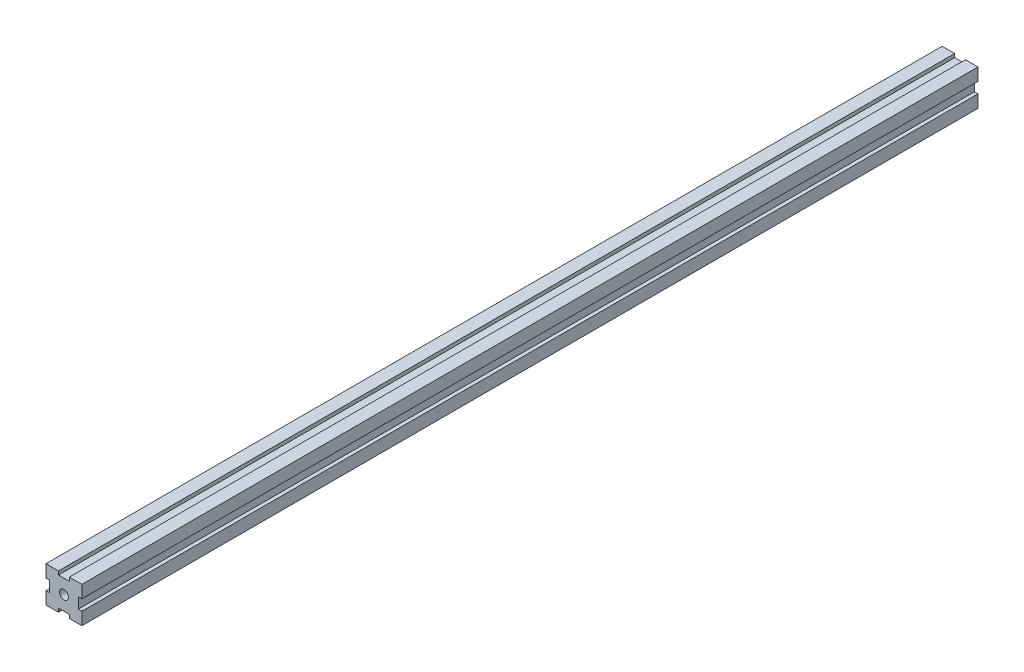
ISO-10303-21;
HEADER;
FILE_DESCRIPTION(('STEP AP214'),'2;1');
FILE_NAME('part.step','',(''),(''),'','','');
FILE_SCHEMA(('AUTOMOTIVE_DESIGN { 1 0 10303 214 1 1 1 1 }'));
ENDSEC;
DATA;
#1=APPLICATION_CONTEXT('core data for automotive mechanical design processes');
#2=APPLICATION_PROTOCOL_DEFINITION('international standard','automotive_design',2000,#1);
#3=PRODUCT_CONTEXT('',#1,'mechanical');
#4=PRODUCT('Part','Part','',(#3));
#5=PRODUCT_RELATED_PRODUCT_CATEGORY('part','',(#4));
#6=PRODUCT_DEFINITION_FORMATION('','',#4);
#7=PRODUCT_DEFINITION_CONTEXT('part definition',#1,'design');
#8=PRODUCT_DEFINITION('design','',#6,#7);
#9=PRODUCT_DEFINITION_SHAPE('','',#8);
#10=(LENGTH_UNIT() NAMED_UNIT(*) SI_UNIT(.MILLI.,.METRE.));
#11=(NAMED_UNIT(*) PLANE_ANGLE_UNIT() SI_UNIT($,.RADIAN.));
#12=(NAMED_UNIT(*) SI_UNIT($,.STERADIAN.) SOLID_ANGLE_UNIT());
#13=UNCERTAINTY_MEASURE_WITH_UNIT(LENGTH_MEASURE(1.E-05),#10,'distance_accuracy_value','');
#14=(GEOMETRIC_REPRESENTATION_CONTEXT(3) GLOBAL_UNCERTAINTY_ASSIGNED_CONTEXT((#13)) GLOBAL_UNIT_ASSIGNED_CONTEXT((#10,
#11,#12)) REPRESENTATION_CONTEXT('',''));
#15=CARTESIAN_POINT('',(0.,0.,0.));
#16=DIRECTION('',(0.,0.,1.));
#17=DIRECTION('',(1.,0.,0.));
#18=AXIS2_PLACEMENT_3D('',#15,#16,#17);
#19=CARTESIAN_POINT('',(0.,0.,500.));
#20=DIRECTION('',(0.,0.,1.));
#21=DIRECTION('',(1.,0.,0.));
#22=AXIS2_PLACEMENT_3D('',#19,#20,#21);
#23=PLANE('',#22);
#24=DIRECTION('',(0.,-1.,0.));
#25=VECTOR('',#24,1.);
#26=CARTESIAN_POINT('',(0.,0.,500.));
#27=LINE('',#26,#25);
#28=CARTESIAN_POINT('',(0.,0.,500.));
#29=VERTEX_POINT('',#28);
#30=CARTESIAN_POINT('',(0.,-7.,500.));
#31=VERTEX_POINT('',#30);
#32=EDGE_CURVE('E243',#29,#31,#27,.T.);
#33=ORIENTED_EDGE('',*,*,#32,.T.);
#34=DIRECTION('',(1.,0.,0.));
#35=VECTOR('',#34,1.);
#36=CARTESIAN_POINT('',(0.,-7.,500.));
#37=LINE('',#36,#35);
#38=CARTESIAN_POINT('',(2.,-7.,500.));
#39=VERTEX_POINT('',#38);
#40=EDGE_CURVE('E131',#31,#39,#37,.T.);
#41=ORIENTED_EDGE('',*,*,#40,.T.);
#42=DIRECTION('',(0.,-1.,0.));
#43=VECTOR('',#42,1.);
#44=CARTESIAN_POINT('',(2.,-7.,500.));
#45=LINE('',#44,#43);
#46=CARTESIAN_POINT('',(2.,-13.,500.));
#47=VERTEX_POINT('',#46);
#48=EDGE_CURVE('E294',#39,#47,#45,.T.);
#49=ORIENTED_EDGE('',*,*,#48,.T.);
#50=DIRECTION('',(-1.,0.,0.));
#51=VECTOR('',#50,1.);
#52=CARTESIAN_POINT('',(0.,-13.,500.));
#53=LINE('',#52,#51);
#54=CARTESIAN_POINT('',(0.,-13.,500.));
#55=VERTEX_POINT('',#54);
#56=EDGE_CURVE('E313',#47,#55,#53,.T.);
#57=ORIENTED_EDGE('',*,*,#56,.T.);
#58=DIRECTION('',(0.,-1.,0.));
#59=VECTOR('',#58,1.);
#60=CARTESIAN_POINT('',(0.,-13.,500.));
#61=LINE('',#60,#59);
#62=CARTESIAN_POINT('',(0.,-20.,500.));
#63=VERTEX_POINT('',#62);
#64=EDGE_CURVE('E310',#55,#63,#61,.T.);
#65=ORIENTED_EDGE('',*,*,#64,.T.);
#66=DIRECTION('',(1.,0.,0.));
#67=VECTOR('',#66,1.);
#68=CARTESIAN_POINT('',(0.,-20.,500.));
#69=LINE('',#68,#67);
#70=CARTESIAN_POINT('',(7.,-20.,500.));
#71=VERTEX_POINT('',#70);
#72=EDGE_CURVE('E312',#63,#71,#69,.T.);
#73=ORIENTED_EDGE('',*,*,#72,.T.);
#74=DIRECTION('',(0.,1.,0.));
#75=VECTOR('',#74,1.);
#76=CARTESIAN_POINT('',(7.,-20.,500.));
#77=LINE('',#76,#75);
#78=CARTESIAN_POINT('',(7.,-18.,500.));
#79=VERTEX_POINT('',#78);
#80=EDGE_CURVE('E315',#71,#79,#77,.T.);
#81=ORIENTED_EDGE('',*,*,#80,.T.);
#82=DIRECTION('',(1.,0.,0.));
#83=VECTOR('',#82,1.);
#84=CARTESIAN_POINT('',(7.,-18.,500.));
#85=LINE('',#84,#83);
#86=CARTESIAN_POINT('',(13.,-18.,500.));
#87=VERTEX_POINT('',#86);
#88=EDGE_CURVE('E321',#79,#87,#85,.T.);
#89=ORIENTED_EDGE('',*,*,#88,.T.);
#90=DIRECTION('',(0.,-1.,0.));
#91=VECTOR('',#90,1.);
#92=CARTESIAN_POINT('',(13.,-20.,500.));
#93=LINE('',#92,#91);
#94=CARTESIAN_POINT('',(13.,-20.,500.));
#95=VERTEX_POINT('',#94);
#96=EDGE_CURVE('E323',#87,#95,#93,.T.);
#97=ORIENTED_EDGE('',*,*,#96,.T.);
#98=DIRECTION('',(1.,0.,0.));
#99=VECTOR('',#98,1.);
#100=CARTESIAN_POINT('',(13.,-20.,500.));
#101=LINE('',#100,#99);
#102=CARTESIAN_POINT('',(20.,-20.,500.));
#103=VERTEX_POINT('',#102);
#104=EDGE_CURVE('E325',#95,#103,#101,.T.);
#105=ORIENTED_EDGE('',*,*,#104,.T.);
#106=DIRECTION('',(0.,1.,0.));
#107=VECTOR('',#106,1.);
#108=CARTESIAN_POINT('',(20.,-13.,500.));
#109=LINE('',#108,#107);
#110=CARTESIAN_POINT('',(20.,-13.,500.));
#111=VERTEX_POINT('',#110);
#112=EDGE_CURVE('E327',#103,#111,#109,.T.);
#113=ORIENTED_EDGE('',*,*,#112,.T.);
#114=DIRECTION('',(-1.,0.,0.));
#115=VECTOR('',#114,1.);
#116=CARTESIAN_POINT('',(20.,-13.,500.));
#117=LINE('',#116,#115);
#118=CARTESIAN_POINT('',(18.,-13.,500.));
#119=VERTEX_POINT('',#118);
#120=EDGE_CURVE('E329',#111,#119,#117,.T.);
#121=ORIENTED_EDGE('',*,*,#120,.T.);
#122=DIRECTION('',(0.,1.,0.));
#123=VECTOR('',#122,1.);
#124=CARTESIAN_POINT('',(18.,-7.,500.));
#125=LINE('',#124,#123);
#126=CARTESIAN_POINT('',(18.,-7.,500.));
#127=VERTEX_POINT('',#126);
#128=EDGE_CURVE('E331',#119,#127,#125,.T.);
#129=ORIENTED_EDGE('',*,*,#128,.T.);
#130=DIRECTION('',(1.,0.,0.));
#131=VECTOR('',#130,1.);
#132=CARTESIAN_POINT('',(20.,-7.,500.));
#133=LINE('',#132,#131);
#134=CARTESIAN_POINT('',(20.,-7.,500.));
#135=VERTEX_POINT('',#134);
#136=EDGE_CURVE('E333',#127,#135,#133,.T.);
#137=ORIENTED_EDGE('',*,*,#136,.T.);
#138=DIRECTION('',(0.,1.,0.));
#139=VECTOR('',#138,1.);
#140=CARTESIAN_POINT('',(20.,0.,500.));
#141=LINE('',#140,#139);
#142=CARTESIAN_POINT('',(20.,0.,500.));
#143=VERTEX_POINT('',#142);
#144=EDGE_CURVE('E335',#135,#143,#141,.T.);
#145=ORIENTED_EDGE('',*,*,#144,.T.);
#146=DIRECTION('',(-1.,0.,0.));
#147=VECTOR('',#146,1.);
#148=CARTESIAN_POINT('',(13.,0.,500.));
#149=LINE('',#148,#147);
#150=CARTESIAN_POINT('',(13.,0.,500.));
#151=VERTEX_POINT('',#150);
#152=EDGE_CURVE('E337',#143,#151,#149,.T.);
#153=ORIENTED_EDGE('',*,*,#152,.T.);
#154=DIRECTION('',(0.,-1.,0.));
#155=VECTOR('',#154,1.);
#156=CARTESIAN_POINT('',(13.,0.,500.));
#157=LINE('',#156,#155);
#158=CARTESIAN_POINT('',(13.,-2.,500.));
#159=VERTEX_POINT('',#158);
#160=EDGE_CURVE('E186',#151,#159,#157,.T.);
#161=ORIENTED_EDGE('',*,*,#160,.T.);
#162=DIRECTION('',(-1.,0.,0.));
#163=VECTOR('',#162,1.);
#164=CARTESIAN_POINT('',(7.,-2.,500.));
#165=LINE('',#164,#163);
#166=CARTESIAN_POINT('',(7.,-2.,500.));
#167=VERTEX_POINT('',#166);
#168=EDGE_CURVE('E180',#159,#167,#165,.T.);
#169=ORIENTED_EDGE('',*,*,#168,.T.);
#170=DIRECTION('',(0.,1.,0.));
#171=VECTOR('',#170,1.);
#172=CARTESIAN_POINT('',(7.,0.,500.));
#173=LINE('',#172,#171);
#174=CARTESIAN_POINT('',(7.,0.,500.));
#175=VERTEX_POINT('',#174);
#176=EDGE_CURVE('E184',#167,#175,#173,.T.);
#177=ORIENTED_EDGE('',*,*,#176,.T.);
#178=DIRECTION('',(-1.,0.,0.));
#179=VECTOR('',#178,1.);
#180=CARTESIAN_POINT('',(0.,0.,500.));
#181=LINE('',#180,#179);
#182=EDGE_CURVE('E52',#175,#29,#181,.T.);
#183=ORIENTED_EDGE('',*,*,#182,.T.);
#184=EDGE_LOOP('',(#33,#41,#49,#57,#65,#73,#81,#89,#97,#105,#113,#121,#129,#137,#145,#153,#161,
#169,#177,#183));
#185=FACE_BOUND('',#184,.T.);
#186=CARTESIAN_POINT('',(10.,-10.,500.));
#187=DIRECTION('',(0.,0.,1.));
#188=DIRECTION('',(1.,0.,0.));
#189=AXIS2_PLACEMENT_3D('',#186,#187,#188);
#190=CIRCLE('',#189,2.5);
#191=CARTESIAN_POINT('',(12.5,-10.,500.));
#192=VERTEX_POINT('',#191);
#193=EDGE_CURVE('E208',#192,#192,#190,.T.);
#194=ORIENTED_EDGE('',*,*,#193,.F.);
#195=EDGE_LOOP('',(#194));
#196=FACE_BOUND('',#195,.T.);
#197=ADVANCED_FACE('F35',(#185,#196),#23,.T.);
#198=CARTESIAN_POINT('',(0.,0.,0.));
#199=DIRECTION('',(0.,0.,1.));
#200=DIRECTION('',(1.,0.,0.));
#201=AXIS2_PLACEMENT_3D('',#198,#199,#200);
#202=PLANE('',#201);
#203=DIRECTION('',(0.,-1.,0.));
#204=VECTOR('',#203,1.);
#205=CARTESIAN_POINT('',(0.,0.,0.));
#206=LINE('',#205,#204);
#207=CARTESIAN_POINT('',(0.,0.,0.));
#208=VERTEX_POINT('',#207);
#209=CARTESIAN_POINT('',(0.,-7.,0.));
#210=VERTEX_POINT('',#209);
#211=EDGE_CURVE('E204',#208,#210,#206,.T.);
#212=ORIENTED_EDGE('',*,*,#211,.F.);
#213=DIRECTION('',(-1.,0.,0.));
#214=VECTOR('',#213,1.);
#215=CARTESIAN_POINT('',(0.,0.,0.));
#216=LINE('',#215,#214);
#217=CARTESIAN_POINT('',(7.,0.,0.));
#218=VERTEX_POINT('',#217);
#219=EDGE_CURVE('E123',#218,#208,#216,.T.);
#220=ORIENTED_EDGE('',*,*,#219,.F.);
#221=DIRECTION('',(0.,1.,0.));
#222=VECTOR('',#221,1.);
#223=CARTESIAN_POINT('',(7.,0.,0.));
#224=LINE('',#223,#222);
#225=CARTESIAN_POINT('',(7.,-2.,0.));
#226=VERTEX_POINT('',#225);
#227=EDGE_CURVE('E117',#226,#218,#224,.T.);
#228=ORIENTED_EDGE('',*,*,#227,.F.);
#229=DIRECTION('',(-1.,0.,0.));
#230=VECTOR('',#229,1.);
#231=CARTESIAN_POINT('',(7.,-2.,0.));
#232=LINE('',#231,#230);
#233=CARTESIAN_POINT('',(13.,-2.,0.));
#234=VERTEX_POINT('',#233);
#235=EDGE_CURVE('E194',#234,#226,#232,.T.);
#236=ORIENTED_EDGE('',*,*,#235,.F.);
#237=DIRECTION('',(0.,-1.,0.));
#238=VECTOR('',#237,1.);
#239=CARTESIAN_POINT('',(13.,0.,0.));
#240=LINE('',#239,#238);
#241=CARTESIAN_POINT('',(13.,0.,0.));
#242=VERTEX_POINT('',#241);
#243=EDGE_CURVE('E238',#242,#234,#240,.T.);
#244=ORIENTED_EDGE('',*,*,#243,.F.);
#245=DIRECTION('',(-1.,0.,0.));
#246=VECTOR('',#245,1.);
#247=CARTESIAN_POINT('',(13.,0.,0.));
#248=LINE('',#247,#246);
#249=CARTESIAN_POINT('',(20.,0.,0.));
#250=VERTEX_POINT('',#249);
#251=EDGE_CURVE('E236',#250,#242,#248,.T.);
#252=ORIENTED_EDGE('',*,*,#251,.F.);
#253=DIRECTION('',(0.,1.,0.));
#254=VECTOR('',#253,1.);
#255=CARTESIAN_POINT('',(20.,0.,0.));
#256=LINE('',#255,#254);
#257=CARTESIAN_POINT('',(20.,-7.,0.));
#258=VERTEX_POINT('',#257);
#259=EDGE_CURVE('E234',#258,#250,#256,.T.);
#260=ORIENTED_EDGE('',*,*,#259,.F.);
#261=DIRECTION('',(1.,0.,0.));
#262=VECTOR('',#261,1.);
#263=CARTESIAN_POINT('',(20.,-7.,0.));
#264=LINE('',#263,#262);
#265=CARTESIAN_POINT('',(18.,-7.,0.));
#266=VERTEX_POINT('',#265);
#267=EDGE_CURVE('E232',#266,#258,#264,.T.);
#268=ORIENTED_EDGE('',*,*,#267,.F.);
#269=DIRECTION('',(0.,1.,0.));
#270=VECTOR('',#269,1.);
#271=CARTESIAN_POINT('',(18.,-7.,0.));
#272=LINE('',#271,#270);
#273=CARTESIAN_POINT('',(18.,-13.,0.));
#274=VERTEX_POINT('',#273);
#275=EDGE_CURVE('E230',#274,#266,#272,.T.);
#276=ORIENTED_EDGE('',*,*,#275,.F.);
#277=DIRECTION('',(-1.,0.,0.));
#278=VECTOR('',#277,1.);
#279=CARTESIAN_POINT('',(20.,-13.,0.));
#280=LINE('',#279,#278);
#281=CARTESIAN_POINT('',(20.,-13.,0.));
#282=VERTEX_POINT('',#281);
#283=EDGE_CURVE('E228',#282,#274,#280,.T.);
#284=ORIENTED_EDGE('',*,*,#283,.F.);
#285=DIRECTION('',(0.,1.,0.));
#286=VECTOR('',#285,1.);
#287=CARTESIAN_POINT('',(20.,-13.,0.));
#288=LINE('',#287,#286);
#289=CARTESIAN_POINT('',(20.,-20.,0.));
#290=VERTEX_POINT('',#289);
#291=EDGE_CURVE('E226',#290,#282,#288,.T.);
#292=ORIENTED_EDGE('',*,*,#291,.F.);
#293=DIRECTION('',(1.,0.,0.));
#294=VECTOR('',#293,1.);
#295=CARTESIAN_POINT('',(13.,-20.,0.));
#296=LINE('',#295,#294);
#297=CARTESIAN_POINT('',(13.,-20.,0.));
#298=VERTEX_POINT('',#297);
#299=EDGE_CURVE('E224',#298,#290,#296,.T.);
#300=ORIENTED_EDGE('',*,*,#299,.F.);
#301=DIRECTION('',(0.,-1.,0.));
#302=VECTOR('',#301,1.);
#303=CARTESIAN_POINT('',(13.,-20.,0.));
#304=LINE('',#303,#302);
#305=CARTESIAN_POINT('',(13.,-18.,0.));
#306=VERTEX_POINT('',#305);
#307=EDGE_CURVE('E222',#306,#298,#304,.T.);
#308=ORIENTED_EDGE('',*,*,#307,.F.);
#309=DIRECTION('',(1.,0.,0.));
#310=VECTOR('',#309,1.);
#311=CARTESIAN_POINT('',(7.,-18.,0.));
#312=LINE('',#311,#310);
#313=CARTESIAN_POINT('',(7.,-18.,0.));
#314=VERTEX_POINT('',#313);
#315=EDGE_CURVE('E220',#314,#306,#312,.T.);
#316=ORIENTED_EDGE('',*,*,#315,.F.);
#317=DIRECTION('',(0.,1.,0.));
#318=VECTOR('',#317,1.);
#319=CARTESIAN_POINT('',(7.,-20.,0.));
#320=LINE('',#319,#318);
#321=CARTESIAN_POINT('',(7.,-20.,0.));
#322=VERTEX_POINT('',#321);
#323=EDGE_CURVE('E218',#322,#314,#320,.T.);
#324=ORIENTED_EDGE('',*,*,#323,.F.);
#325=DIRECTION('',(1.,0.,0.));
#326=VECTOR('',#325,1.);
#327=CARTESIAN_POINT('',(0.,-20.,0.));
#328=LINE('',#327,#326);
#329=CARTESIAN_POINT('',(0.,-20.,0.));
#330=VERTEX_POINT('',#329);
#331=EDGE_CURVE('E216',#330,#322,#328,.T.);
#332=ORIENTED_EDGE('',*,*,#331,.F.);
#333=DIRECTION('',(0.,-1.,0.));
#334=VECTOR('',#333,1.);
#335=CARTESIAN_POINT('',(0.,-13.,0.));
#336=LINE('',#335,#334);
#337=CARTESIAN_POINT('',(0.,-13.,0.));
#338=VERTEX_POINT('',#337);
#339=EDGE_CURVE('E214',#338,#330,#336,.T.);
#340=ORIENTED_EDGE('',*,*,#339,.F.);
#341=DIRECTION('',(-1.,0.,0.));
#342=VECTOR('',#341,1.);
#343=CARTESIAN_POINT('',(0.,-13.,0.));
#344=LINE('',#343,#342);
#345=CARTESIAN_POINT('',(2.,-13.,0.));
#346=VERTEX_POINT('',#345);
#347=EDGE_CURVE('E212',#346,#338,#344,.T.);
#348=ORIENTED_EDGE('',*,*,#347,.F.);
#349=DIRECTION('',(0.,-1.,0.));
#350=VECTOR('',#349,1.);
#351=CARTESIAN_POINT('',(2.,-7.,0.));
#352=LINE('',#351,#350);
#353=CARTESIAN_POINT('',(2.,-7.,0.));
#354=VERTEX_POINT('',#353);
#355=EDGE_CURVE('E210',#354,#346,#352,.T.);
#356=ORIENTED_EDGE('',*,*,#355,.F.);
#357=DIRECTION('',(1.,0.,0.));
#358=VECTOR('',#357,1.);
#359=CARTESIAN_POINT('',(0.,-7.,0.));
#360=LINE('',#359,#358);
#361=EDGE_CURVE('E207',#210,#354,#360,.T.);
#362=ORIENTED_EDGE('',*,*,#361,.F.);
#363=EDGE_LOOP('',(#212,#220,#228,#236,#244,#252,#260,#268,#276,#284,#292,#300,#308,#316,#324,
#332,#340,#348,#356,#362));
#364=FACE_BOUND('',#363,.T.);
#365=CARTESIAN_POINT('',(10.,-10.,0.));
#366=DIRECTION('',(0.,0.,1.));
#367=DIRECTION('',(1.,0.,0.));
#368=AXIS2_PLACEMENT_3D('',#365,#366,#367);
#369=CIRCLE('',#368,2.5);
#370=CARTESIAN_POINT('',(12.5,-10.,0.));
#371=VERTEX_POINT('',#370);
#372=EDGE_CURVE('E588',#371,#371,#369,.T.);
#373=ORIENTED_EDGE('',*,*,#372,.T.);
#374=EDGE_LOOP('',(#373));
#375=FACE_BOUND('',#374,.T.);
#376=ADVANCED_FACE('F298',(#364,#375),#202,.F.);
#377=CARTESIAN_POINT('',(0.,0.,500.));
#378=DIRECTION('',(1.,0.,0.));
#379=DIRECTION('',(0.,1.,0.));
#380=AXIS2_PLACEMENT_3D('',#377,#378,#379);
#381=PLANE('',#380);
#382=ORIENTED_EDGE('',*,*,#211,.T.);
#383=DIRECTION('',(0.,0.,-1.));
#384=VECTOR('',#383,1.);
#385=CARTESIAN_POINT('',(0.,-7.,500.));
#386=LINE('',#385,#384);
#387=EDGE_CURVE('E11',#31,#210,#386,.T.);
#388=ORIENTED_EDGE('',*,*,#387,.F.);
#389=ORIENTED_EDGE('',*,*,#32,.F.);
#390=DIRECTION('',(0.,0.,-1.));
#391=VECTOR('',#390,1.);
#392=CARTESIAN_POINT('',(0.,0.,500.));
#393=LINE('',#392,#391);
#394=EDGE_CURVE('E200',#29,#208,#393,.T.);
#395=ORIENTED_EDGE('',*,*,#394,.T.);
#396=EDGE_LOOP('',(#382,#388,#389,#395));
#397=FACE_BOUND('',#396,.T.);
#398=ADVANCED_FACE('F37',(#397),#381,.F.);
#399=CARTESIAN_POINT('',(0.,-7.,500.));
#400=DIRECTION('',(0.,1.,0.));
#401=DIRECTION('',(-1.,0.,0.));
#402=AXIS2_PLACEMENT_3D('',#399,#400,#401);
#403=PLANE('',#402);
#404=ORIENTED_EDGE('',*,*,#361,.T.);
#405=DIRECTION('',(0.,0.,-1.));
#406=VECTOR('',#405,1.);
#407=CARTESIAN_POINT('',(2.,-7.,500.));
#408=LINE('',#407,#406);
#409=EDGE_CURVE('E44',#39,#354,#408,.T.);
#410=ORIENTED_EDGE('',*,*,#409,.F.);
#411=ORIENTED_EDGE('',*,*,#40,.F.);
#412=ORIENTED_EDGE('',*,*,#387,.T.);
#413=EDGE_LOOP('',(#404,#410,#411,#412));
#414=FACE_BOUND('',#413,.T.);
#415=ADVANCED_FACE('F371',(#414),#403,.F.);
#416=CARTESIAN_POINT('',(2.,-7.,500.));
#417=DIRECTION('',(1.,0.,0.));
#418=DIRECTION('',(0.,0.,-1.));
#419=AXIS2_PLACEMENT_3D('',#416,#417,#418);
#420=PLANE('',#419);
#421=ORIENTED_EDGE('',*,*,#355,.T.);
#422=DIRECTION('',(0.,0.,-1.));
#423=VECTOR('',#422,1.);
#424=CARTESIAN_POINT('',(2.,-13.,500.));
#425=LINE('',#424,#423);
#426=EDGE_CURVE('E286',#47,#346,#425,.T.);
#427=ORIENTED_EDGE('',*,*,#426,.F.);
#428=ORIENTED_EDGE('',*,*,#48,.F.);
#429=ORIENTED_EDGE('',*,*,#409,.T.);
#430=EDGE_LOOP('',(#421,#427,#428,#429));
#431=FACE_BOUND('',#430,.T.);
#432=ADVANCED_FACE('F292',(#431),#420,.F.);
#433=CARTESIAN_POINT('',(0.,-13.,500.));
#434=DIRECTION('',(0.,-1.,0.));
#435=DIRECTION('',(1.,0.,0.));
#436=AXIS2_PLACEMENT_3D('',#433,#434,#435);
#437=PLANE('',#436);
#438=ORIENTED_EDGE('',*,*,#347,.T.);
#439=DIRECTION('',(0.,0.,-1.));
#440=VECTOR('',#439,1.);
#441=CARTESIAN_POINT('',(0.,-13.,500.));
#442=LINE('',#441,#440);
#443=EDGE_CURVE('E283',#55,#338,#442,.T.);
#444=ORIENTED_EDGE('',*,*,#443,.F.);
#445=ORIENTED_EDGE('',*,*,#56,.F.);
#446=ORIENTED_EDGE('',*,*,#426,.T.);
#447=EDGE_LOOP('',(#438,#444,#445,#446));
#448=FACE_BOUND('',#447,.T.);
#449=ADVANCED_FACE('F304',(#448),#437,.F.);
#450=CARTESIAN_POINT('',(0.,-13.,500.));
#451=DIRECTION('',(1.,0.,0.));
#452=DIRECTION('',(0.,1.,0.));
#453=AXIS2_PLACEMENT_3D('',#450,#451,#452);
#454=PLANE('',#453);
#455=ORIENTED_EDGE('',*,*,#339,.T.);
#456=DIRECTION('',(0.,0.,-1.));
#457=VECTOR('',#456,1.);
#458=CARTESIAN_POINT('',(0.,-20.,500.));
#459=LINE('',#458,#457);
#460=EDGE_CURVE('E280',#63,#330,#459,.T.);
#461=ORIENTED_EDGE('',*,*,#460,.F.);
#462=ORIENTED_EDGE('',*,*,#64,.F.);
#463=ORIENTED_EDGE('',*,*,#443,.T.);
#464=EDGE_LOOP('',(#455,#461,#462,#463));
#465=FACE_BOUND('',#464,.T.);
#466=ADVANCED_FACE('F308',(#465),#454,.F.);
#467=CARTESIAN_POINT('',(0.,-20.,500.));
#468=DIRECTION('',(0.,1.,0.));
#469=DIRECTION('',(0.,0.,1.));
#470=AXIS2_PLACEMENT_3D('',#467,#468,#469);
#471=PLANE('',#470);
#472=ORIENTED_EDGE('',*,*,#331,.T.);
#473=DIRECTION('',(0.,0.,-1.));
#474=VECTOR('',#473,1.);
#475=CARTESIAN_POINT('',(7.,-20.,500.));
#476=LINE('',#475,#474);
#477=EDGE_CURVE('E277',#71,#322,#476,.T.);
#478=ORIENTED_EDGE('',*,*,#477,.F.);
#479=ORIENTED_EDGE('',*,*,#72,.F.);
#480=ORIENTED_EDGE('',*,*,#460,.T.);
#481=EDGE_LOOP('',(#472,#478,#479,#480));
#482=FACE_BOUND('',#481,.T.);
#483=ADVANCED_FACE('F384',(#482),#471,.F.);
#484=CARTESIAN_POINT('',(7.,-20.,500.));
#485=DIRECTION('',(-1.,0.,0.));
#486=DIRECTION('',(0.,-1.,0.));
#487=AXIS2_PLACEMENT_3D('',#484,#485,#486);
#488=PLANE('',#487);
#489=ORIENTED_EDGE('',*,*,#323,.T.);
#490=DIRECTION('',(0.,0.,-1.));
#491=VECTOR('',#490,1.);
#492=CARTESIAN_POINT('',(7.,-18.,500.));
#493=LINE('',#492,#491);
#494=EDGE_CURVE('E274',#79,#314,#493,.T.);
#495=ORIENTED_EDGE('',*,*,#494,.F.);
#496=ORIENTED_EDGE('',*,*,#80,.F.);
#497=ORIENTED_EDGE('',*,*,#477,.T.);
#498=EDGE_LOOP('',(#489,#495,#496,#497));
#499=FACE_BOUND('',#498,.T.);
#500=ADVANCED_FACE('F387',(#499),#488,.F.);
#501=CARTESIAN_POINT('',(7.,-18.,500.));
#502=DIRECTION('',(0.,1.,0.));
#503=DIRECTION('',(0.,0.,1.));
#504=AXIS2_PLACEMENT_3D('',#501,#502,#503);
#505=PLANE('',#504);
#506=ORIENTED_EDGE('',*,*,#315,.T.);
#507=DIRECTION('',(0.,0.,-1.));
#508=VECTOR('',#507,1.);
#509=CARTESIAN_POINT('',(13.,-18.,500.));
#510=LINE('',#509,#508);
#511=EDGE_CURVE('E271',#87,#306,#510,.T.);
#512=ORIENTED_EDGE('',*,*,#511,.F.);
#513=ORIENTED_EDGE('',*,*,#88,.F.);
#514=ORIENTED_EDGE('',*,*,#494,.T.);
#515=EDGE_LOOP('',(#506,#512,#513,#514));
#516=FACE_BOUND('',#515,.T.);
#517=ADVANCED_FACE('F391',(#516),#505,.F.);
#518=CARTESIAN_POINT('',(13.,-20.,500.));
#519=DIRECTION('',(1.,0.,0.));
#520=DIRECTION('',(0.,1.,0.));
#521=AXIS2_PLACEMENT_3D('',#518,#519,#520);
#522=PLANE('',#521);
#523=ORIENTED_EDGE('',*,*,#307,.T.);
#524=DIRECTION('',(0.,0.,-1.));
#525=VECTOR('',#524,1.);
#526=CARTESIAN_POINT('',(13.,-20.,500.));
#527=LINE('',#526,#525);
#528=EDGE_CURVE('E268',#95,#298,#527,.T.);
#529=ORIENTED_EDGE('',*,*,#528,.F.);
#530=ORIENTED_EDGE('',*,*,#96,.F.);
#531=ORIENTED_EDGE('',*,*,#511,.T.);
#532=EDGE_LOOP('',(#523,#529,#530,#531));
#533=FACE_BOUND('',#532,.T.);
#534=ADVANCED_FACE('F395',(#533),#522,.F.);
#535=CARTESIAN_POINT('',(13.,-20.,500.));
#536=DIRECTION('',(0.,1.,0.));
#537=DIRECTION('',(0.,0.,1.));
#538=AXIS2_PLACEMENT_3D('',#535,#536,#537);
#539=PLANE('',#538);
#540=ORIENTED_EDGE('',*,*,#299,.T.);
#541=DIRECTION('',(0.,0.,-1.));
#542=VECTOR('',#541,1.);
#543=CARTESIAN_POINT('',(20.,-20.,500.));
#544=LINE('',#543,#542);
#545=EDGE_CURVE('E265',#103,#290,#544,.T.);
#546=ORIENTED_EDGE('',*,*,#545,.F.);
#547=ORIENTED_EDGE('',*,*,#104,.F.);
#548=ORIENTED_EDGE('',*,*,#528,.T.);
#549=EDGE_LOOP('',(#540,#546,#547,#548));
#550=FACE_BOUND('',#549,.T.);
#551=ADVANCED_FACE('F399',(#550),#539,.F.);
#552=CARTESIAN_POINT('',(20.,-13.,500.));
#553=DIRECTION('',(-1.,0.,0.));
#554=DIRECTION('',(0.,0.,1.));
#555=AXIS2_PLACEMENT_3D('',#552,#553,#554);
#556=PLANE('',#555);
#557=ORIENTED_EDGE('',*,*,#291,.T.);
#558=DIRECTION('',(0.,0.,-1.));
#559=VECTOR('',#558,1.);
#560=CARTESIAN_POINT('',(20.,-13.,500.));
#561=LINE('',#560,#559);
#562=EDGE_CURVE('E262',#111,#282,#561,.T.);
#563=ORIENTED_EDGE('',*,*,#562,.F.);
#564=ORIENTED_EDGE('',*,*,#112,.F.);
#565=ORIENTED_EDGE('',*,*,#545,.T.);
#566=EDGE_LOOP('',(#557,#563,#564,#565));
#567=FACE_BOUND('',#566,.T.);
#568=ADVANCED_FACE('F403',(#567),#556,.F.);
#569=CARTESIAN_POINT('',(20.,-13.,500.));
#570=DIRECTION('',(0.,-1.,0.));
#571=DIRECTION('',(1.,0.,0.));
#572=AXIS2_PLACEMENT_3D('',#569,#570,#571);
#573=PLANE('',#572);
#574=ORIENTED_EDGE('',*,*,#283,.T.);
#575=DIRECTION('',(0.,0.,-1.));
#576=VECTOR('',#575,1.);
#577=CARTESIAN_POINT('',(18.,-13.,500.));
#578=LINE('',#577,#576);
#579=EDGE_CURVE('E259',#119,#274,#578,.T.);
#580=ORIENTED_EDGE('',*,*,#579,.F.);
#581=ORIENTED_EDGE('',*,*,#120,.F.);
#582=ORIENTED_EDGE('',*,*,#562,.T.);
#583=EDGE_LOOP('',(#574,#580,#581,#582));
#584=FACE_BOUND('',#583,.T.);
#585=ADVANCED_FACE('F407',(#584),#573,.F.);
#586=CARTESIAN_POINT('',(18.,-7.,500.));
#587=DIRECTION('',(-1.,0.,0.));
#588=DIRECTION('',(0.,0.,1.));
#589=AXIS2_PLACEMENT_3D('',#586,#587,#588);
#590=PLANE('',#589);
#591=ORIENTED_EDGE('',*,*,#275,.T.);
#592=DIRECTION('',(0.,0.,-1.));
#593=VECTOR('',#592,1.);
#594=CARTESIAN_POINT('',(18.,-7.,500.));
#595=LINE('',#594,#593);
#596=EDGE_CURVE('E256',#127,#266,#595,.T.);
#597=ORIENTED_EDGE('',*,*,#596,.F.);
#598=ORIENTED_EDGE('',*,*,#128,.F.);
#599=ORIENTED_EDGE('',*,*,#579,.T.);
#600=EDGE_LOOP('',(#591,#597,#598,#599));
#601=FACE_BOUND('',#600,.T.);
#602=ADVANCED_FACE('F411',(#601),#590,.F.);
#603=CARTESIAN_POINT('',(20.,-7.,500.));
#604=DIRECTION('',(0.,1.,0.));
#605=DIRECTION('',(-1.,0.,0.));
#606=AXIS2_PLACEMENT_3D('',#603,#604,#605);
#607=PLANE('',#606);
#608=ORIENTED_EDGE('',*,*,#267,.T.);
#609=DIRECTION('',(0.,0.,-1.));
#610=VECTOR('',#609,1.);
#611=CARTESIAN_POINT('',(20.,-7.,500.));
#612=LINE('',#611,#610);
#613=EDGE_CURVE('E253',#135,#258,#612,.T.);
#614=ORIENTED_EDGE('',*,*,#613,.F.);
#615=ORIENTED_EDGE('',*,*,#136,.F.);
#616=ORIENTED_EDGE('',*,*,#596,.T.);
#617=EDGE_LOOP('',(#608,#614,#615,#616));
#618=FACE_BOUND('',#617,.T.);
#619=ADVANCED_FACE('F415',(#618),#607,.F.);
#620=CARTESIAN_POINT('',(20.,0.,500.));
#621=DIRECTION('',(-1.,0.,0.));
#622=DIRECTION('',(0.,-1.,0.));
#623=AXIS2_PLACEMENT_3D('',#620,#621,#622);
#624=PLANE('',#623);
#625=ORIENTED_EDGE('',*,*,#259,.T.);
#626=DIRECTION('',(0.,0.,-1.));
#627=VECTOR('',#626,1.);
#628=CARTESIAN_POINT('',(20.,0.,500.));
#629=LINE('',#628,#627);
#630=EDGE_CURVE('E250',#143,#250,#629,.T.);
#631=ORIENTED_EDGE('',*,*,#630,.F.);
#632=ORIENTED_EDGE('',*,*,#144,.F.);
#633=ORIENTED_EDGE('',*,*,#613,.T.);
#634=EDGE_LOOP('',(#625,#631,#632,#633));
#635=FACE_BOUND('',#634,.T.);
#636=ADVANCED_FACE('F419',(#635),#624,.F.);
#637=CARTESIAN_POINT('',(13.,0.,500.));
#638=DIRECTION('',(0.,-1.,0.));
#639=DIRECTION('',(0.,0.,-1.));
#640=AXIS2_PLACEMENT_3D('',#637,#638,#639);
#641=PLANE('',#640);
#642=ORIENTED_EDGE('',*,*,#251,.T.);
#643=DIRECTION('',(0.,0.,-1.));
#644=VECTOR('',#643,1.);
#645=CARTESIAN_POINT('',(13.,0.,500.));
#646=LINE('',#645,#644);
#647=EDGE_CURVE('E247',#151,#242,#646,.T.);
#648=ORIENTED_EDGE('',*,*,#647,.F.);
#649=ORIENTED_EDGE('',*,*,#152,.F.);
#650=ORIENTED_EDGE('',*,*,#630,.T.);
#651=EDGE_LOOP('',(#642,#648,#649,#650));
#652=FACE_BOUND('',#651,.T.);
#653=ADVANCED_FACE('F343',(#652),#641,.F.);
#654=CARTESIAN_POINT('',(13.,0.,500.));
#655=DIRECTION('',(1.,0.,0.));
#656=DIRECTION('',(0.,1.,0.));
#657=AXIS2_PLACEMENT_3D('',#654,#655,#656);
#658=PLANE('',#657);
#659=ORIENTED_EDGE('',*,*,#243,.T.);
#660=DIRECTION('',(0.,0.,-1.));
#661=VECTOR('',#660,1.);
#662=CARTESIAN_POINT('',(13.,-2.,500.));
#663=LINE('',#662,#661);
#664=EDGE_CURVE('E195',#159,#234,#663,.T.);
#665=ORIENTED_EDGE('',*,*,#664,.F.);
#666=ORIENTED_EDGE('',*,*,#160,.F.);
#667=ORIENTED_EDGE('',*,*,#647,.T.);
#668=EDGE_LOOP('',(#659,#665,#666,#667));
#669=FACE_BOUND('',#668,.T.);
#670=ADVANCED_FACE('F347',(#669),#658,.F.);
#671=CARTESIAN_POINT('',(7.,-2.,500.));
#672=DIRECTION('',(0.,-1.,0.));
#673=DIRECTION('',(0.,0.,-1.));
#674=AXIS2_PLACEMENT_3D('',#671,#672,#673);
#675=PLANE('',#674);
#676=ORIENTED_EDGE('',*,*,#235,.T.);
#677=DIRECTION('',(0.,0.,-1.));
#678=VECTOR('',#677,1.);
#679=CARTESIAN_POINT('',(7.,-2.,500.));
#680=LINE('',#679,#678);
#681=EDGE_CURVE('E191',#167,#226,#680,.T.);
#682=ORIENTED_EDGE('',*,*,#681,.F.);
#683=ORIENTED_EDGE('',*,*,#168,.F.);
#684=ORIENTED_EDGE('',*,*,#664,.T.);
#685=EDGE_LOOP('',(#676,#682,#683,#684));
#686=FACE_BOUND('',#685,.T.);
#687=ADVANCED_FACE('F192',(#686),#675,.F.);
#688=CARTESIAN_POINT('',(7.,0.,500.));
#689=DIRECTION('',(-1.,0.,0.));
#690=DIRECTION('',(0.,-1.,0.));
#691=AXIS2_PLACEMENT_3D('',#688,#689,#690);
#692=PLANE('',#691);
#693=ORIENTED_EDGE('',*,*,#227,.T.);
#694=DIRECTION('',(0.,0.,-1.));
#695=VECTOR('',#694,1.);
#696=CARTESIAN_POINT('',(7.,0.,500.));
#697=LINE('',#696,#695);
#698=EDGE_CURVE('E196',#175,#218,#697,.T.);
#699=ORIENTED_EDGE('',*,*,#698,.F.);
#700=ORIENTED_EDGE('',*,*,#176,.F.);
#701=ORIENTED_EDGE('',*,*,#681,.T.);
#702=EDGE_LOOP('',(#693,#699,#700,#701));
#703=FACE_BOUND('',#702,.T.);
#704=ADVANCED_FACE('F198',(#703),#692,.F.);
#705=CARTESIAN_POINT('',(0.,0.,500.));
#706=DIRECTION('',(0.,-1.,0.));
#707=DIRECTION('',(0.,0.,-1.));
#708=AXIS2_PLACEMENT_3D('',#705,#706,#707);
#709=PLANE('',#708);
#710=ORIENTED_EDGE('',*,*,#219,.T.);
#711=ORIENTED_EDGE('',*,*,#394,.F.);
#712=ORIENTED_EDGE('',*,*,#182,.F.);
#713=ORIENTED_EDGE('',*,*,#698,.T.);
#714=EDGE_LOOP('',(#710,#711,#712,#713));
#715=FACE_BOUND('',#714,.T.);
#716=ADVANCED_FACE('F351',(#715),#709,.F.);
#717=CARTESIAN_POINT('',(10.,-10.,500.));
#718=DIRECTION('',(0.,0.,-1.));
#719=DIRECTION('',(-1.,0.,0.));
#720=AXIS2_PLACEMENT_3D('',#717,#718,#719);
#721=CYLINDRICAL_SURFACE('',#720,2.5);
#722=ORIENTED_EDGE('',*,*,#193,.T.);
#723=EDGE_LOOP('',(#722));
#724=FACE_BOUND('',#723,.T.);
#725=ORIENTED_EDGE('',*,*,#372,.F.);
#726=EDGE_LOOP('',(#725));
#727=FACE_BOUND('',#726,.T.);
#728=ADVANCED_FACE('F353',(#724,#727),#721,.F.);
#729=CLOSED_SHELL('',(#197,#376,#398,#415,#432,#449,#466,#483,#500,#517,#534,#551,#568,#585,
#602,#619,#636,#653,#670,#687,#704,#716,#728));
#730=MANIFOLD_SOLID_BREP('B2',#729);
#731=ADVANCED_BREP_SHAPE_REPRESENTATION('',(#18,#730),#14);
#732=SHAPE_DEFINITION_REPRESENTATION(#9,#731);
ENDSEC;
END-ISO-10303-21;
